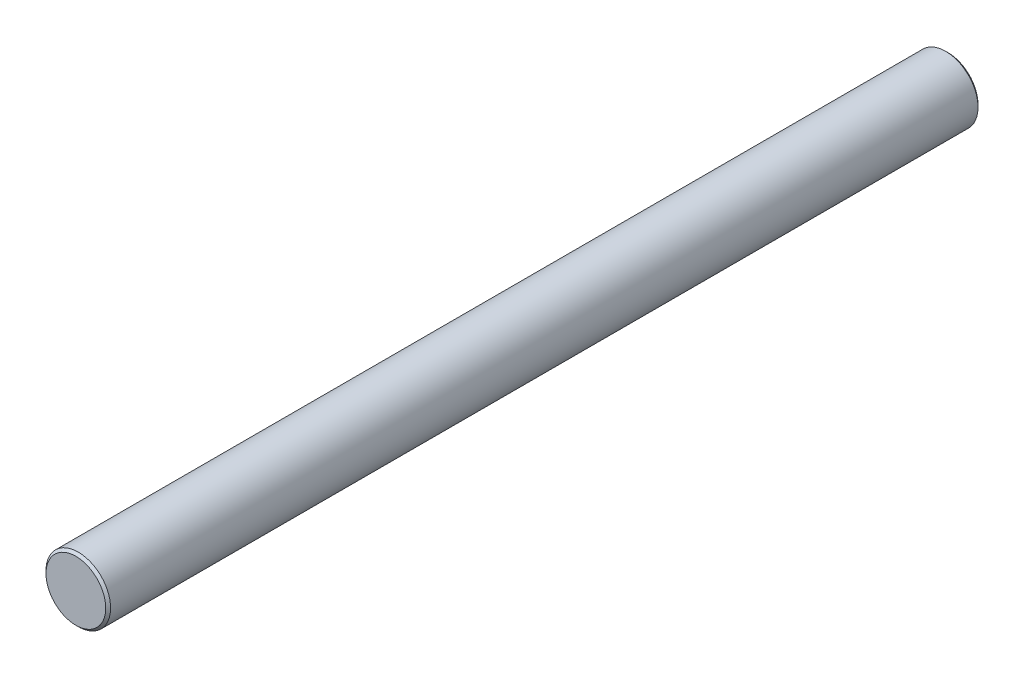
ISO-10303-21;
HEADER;
FILE_DESCRIPTION(('STEP AP214'),'2;1');
FILE_NAME('part.step','',(''),(''),'','','');
FILE_SCHEMA(('AUTOMOTIVE_DESIGN { 1 0 10303 214 1 1 1 1 }'));
ENDSEC;
DATA;
#1=APPLICATION_CONTEXT('core data for automotive mechanical design processes');
#2=APPLICATION_PROTOCOL_DEFINITION('international standard','automotive_design',2000,#1);
#3=PRODUCT_CONTEXT('',#1,'mechanical');
#4=PRODUCT('Part','Part','',(#3));
#5=PRODUCT_RELATED_PRODUCT_CATEGORY('part','',(#4));
#6=PRODUCT_DEFINITION_FORMATION('','',#4);
#7=PRODUCT_DEFINITION_CONTEXT('part definition',#1,'design');
#8=PRODUCT_DEFINITION('design','',#6,#7);
#9=PRODUCT_DEFINITION_SHAPE('','',#8);
#10=(LENGTH_UNIT() NAMED_UNIT(*) SI_UNIT(.MILLI.,.METRE.));
#11=(NAMED_UNIT(*) PLANE_ANGLE_UNIT() SI_UNIT($,.RADIAN.));
#12=(NAMED_UNIT(*) SI_UNIT($,.STERADIAN.) SOLID_ANGLE_UNIT());
#13=UNCERTAINTY_MEASURE_WITH_UNIT(LENGTH_MEASURE(1.E-05),#10,'distance_accuracy_value','');
#14=(GEOMETRIC_REPRESENTATION_CONTEXT(3) GLOBAL_UNCERTAINTY_ASSIGNED_CONTEXT((#13)) GLOBAL_UNIT_ASSIGNED_CONTEXT((#10,
#11,#12)) REPRESENTATION_CONTEXT('',''));
#15=CARTESIAN_POINT('',(0.,0.,0.));
#16=DIRECTION('',(0.,0.,1.));
#17=DIRECTION('',(1.,0.,0.));
#18=AXIS2_PLACEMENT_3D('',#15,#16,#17);
#19=CARTESIAN_POINT('',(0.,9.25,0.));
#20=DIRECTION('',(0.,0.,-1.));
#21=DIRECTION('',(0.,1.,0.));
#22=AXIS2_PLACEMENT_3D('',#19,#20,#21);
#23=PLANE('',#22);
#24=CARTESIAN_POINT('',(0.,0.,0.));
#25=DIRECTION('',(0.,0.,-1.));
#26=DIRECTION('',(0.,1.,0.));
#27=AXIS2_PLACEMENT_3D('',#24,#25,#26);
#28=CIRCLE('',#27,18.5);
#29=CARTESIAN_POINT('',(0.,18.5,0.));
#30=VERTEX_POINT('',#29);
#31=EDGE_CURVE('E9',#30,#30,#28,.T.);
#32=ORIENTED_EDGE('',*,*,#31,.T.);
#33=EDGE_LOOP('',(#32));
#34=FACE_BOUND('',#33,.T.);
#35=CARTESIAN_POINT('',(0.,0.,0.));
#36=DIRECTION('',(0.,0.,1.));
#37=DIRECTION('',(-1.,0.,0.));
#38=AXIS2_PLACEMENT_3D('',#35,#36,#37);
#39=CIRCLE('',#38,6.);
#40=CARTESIAN_POINT('',(-6.,0.,0.));
#41=VERTEX_POINT('',#40);
#42=EDGE_CURVE('E52',#41,#41,#39,.T.);
#43=ORIENTED_EDGE('',*,*,#42,.T.);
#44=EDGE_LOOP('',(#43));
#45=FACE_BOUND('',#44,.T.);
#46=ADVANCED_FACE('F15',(#34,#45),#23,.T.);
#47=CARTESIAN_POINT('',(0.,0.,0.75));
#48=DIRECTION('',(0.,0.,1.));
#49=DIRECTION('',(0.,1.,0.));
#50=AXIS2_PLACEMENT_3D('',#47,#48,#49);
#51=CONICAL_SURFACE('',#50,19.25,0.785398163397448);
#52=CARTESIAN_POINT('',(0.,0.,1.5));
#53=DIRECTION('',(0.,0.,-1.));
#54=DIRECTION('',(0.,1.,0.));
#55=AXIS2_PLACEMENT_3D('',#52,#53,#54);
#56=CIRCLE('',#55,20.);
#57=CARTESIAN_POINT('',(0.,20.,1.5));
#58=VERTEX_POINT('',#57);
#59=EDGE_CURVE('E25',#58,#58,#56,.T.);
#60=ORIENTED_EDGE('',*,*,#59,.T.);
#61=EDGE_LOOP('',(#60));
#62=FACE_BOUND('',#61,.T.);
#63=ORIENTED_EDGE('',*,*,#31,.F.);
#64=EDGE_LOOP('',(#63));
#65=FACE_BOUND('',#64,.T.);
#66=ADVANCED_FACE('F121',(#62,#65),#51,.T.);
#67=CARTESIAN_POINT('',(0.,0.,270.));
#68=DIRECTION('',(0.,0.,1.));
#69=DIRECTION('',(0.,1.,0.));
#70=AXIS2_PLACEMENT_3D('',#67,#68,#69);
#71=CYLINDRICAL_SURFACE('',#70,20.);
#72=CARTESIAN_POINT('',(0.,0.,538.5));
#73=DIRECTION('',(0.,0.,-1.));
#74=DIRECTION('',(0.,1.,0.));
#75=AXIS2_PLACEMENT_3D('',#72,#73,#74);
#76=CIRCLE('',#75,20.);
#77=CARTESIAN_POINT('',(0.,20.,538.5));
#78=VERTEX_POINT('',#77);
#79=EDGE_CURVE('E19',#78,#78,#76,.T.);
#80=ORIENTED_EDGE('',*,*,#79,.T.);
#81=EDGE_LOOP('',(#80));
#82=FACE_BOUND('',#81,.T.);
#83=ORIENTED_EDGE('',*,*,#59,.F.);
#84=EDGE_LOOP('',(#83));
#85=FACE_BOUND('',#84,.T.);
#86=CARTESIAN_POINT('',(0.,0.,6.5));
#87=DIRECTION('',(0.,0.,-1.));
#88=DIRECTION('',(0.,1.,0.));
#89=AXIS2_PLACEMENT_3D('',#86,#87,#88);
#90=CIRCLE('',#89,20.);
#91=CARTESIAN_POINT('',(10.5356537528527,-17.,6.5));
#92=VERTEX_POINT('',#91);
#93=CARTESIAN_POINT('',(-10.5356537528527,-17.,6.5));
#94=VERTEX_POINT('',#93);
#95=EDGE_CURVE('E69',#92,#94,#90,.T.);
#96=ORIENTED_EDGE('',*,*,#95,.T.);
#97=DIRECTION('',(0.,0.,1.));
#98=VECTOR('',#97,1.);
#99=CARTESIAN_POINT('',(-10.5356537528527,-17.,8.25));
#100=LINE('',#99,#98);
#101=CARTESIAN_POINT('',(-10.5356537528527,-17.,10.));
#102=VERTEX_POINT('',#101);
#103=EDGE_CURVE('E62',#94,#102,#100,.T.);
#104=ORIENTED_EDGE('',*,*,#103,.T.);
#105=CARTESIAN_POINT('',(0.,0.,10.));
#106=DIRECTION('',(0.,0.,1.));
#107=DIRECTION('',(0.,1.,0.));
#108=AXIS2_PLACEMENT_3D('',#105,#106,#107);
#109=CIRCLE('',#108,20.);
#110=CARTESIAN_POINT('',(10.5356537528527,-17.,10.));
#111=VERTEX_POINT('',#110);
#112=EDGE_CURVE('E75',#102,#111,#109,.T.);
#113=ORIENTED_EDGE('',*,*,#112,.T.);
#114=DIRECTION('',(0.,0.,-1.));
#115=VECTOR('',#114,1.);
#116=CARTESIAN_POINT('',(10.5356537528527,-17.,8.25));
#117=LINE('',#116,#115);
#118=EDGE_CURVE('E60',#111,#92,#117,.T.);
#119=ORIENTED_EDGE('',*,*,#118,.T.);
#120=EDGE_LOOP('',(#96,#104,#113,#119));
#121=FACE_BOUND('',#120,.T.);
#122=ADVANCED_FACE('F17',(#82,#85,#121),#71,.T.);
#123=CARTESIAN_POINT('',(0.,0.,539.25));
#124=DIRECTION('',(0.,0.,-1.));
#125=DIRECTION('',(0.,1.,0.));
#126=AXIS2_PLACEMENT_3D('',#123,#124,#125);
#127=CONICAL_SURFACE('',#126,19.25,0.785398163397448);
#128=CARTESIAN_POINT('',(0.,0.,540.));
#129=DIRECTION('',(0.,0.,-1.));
#130=DIRECTION('',(0.,1.,0.));
#131=AXIS2_PLACEMENT_3D('',#128,#129,#130);
#132=CIRCLE('',#131,18.5);
#133=CARTESIAN_POINT('',(0.,18.5,540.));
#134=VERTEX_POINT('',#133);
#135=EDGE_CURVE('E44',#134,#134,#132,.T.);
#136=ORIENTED_EDGE('',*,*,#135,.T.);
#137=EDGE_LOOP('',(#136));
#138=FACE_BOUND('',#137,.T.);
#139=ORIENTED_EDGE('',*,*,#79,.F.);
#140=EDGE_LOOP('',(#139));
#141=FACE_BOUND('',#140,.T.);
#142=ADVANCED_FACE('F116',(#138,#141),#127,.T.);
#143=CARTESIAN_POINT('',(0.,9.25,540.));
#144=DIRECTION('',(0.,0.,1.));
#145=DIRECTION('',(0.,-1.,0.));
#146=AXIS2_PLACEMENT_3D('',#143,#144,#145);
#147=PLANE('',#146);
#148=ORIENTED_EDGE('',*,*,#135,.F.);
#149=EDGE_LOOP('',(#148));
#150=FACE_BOUND('',#149,.T.);
#151=ADVANCED_FACE('F110',(#150),#147,.T.);
#152=CARTESIAN_POINT('',(0.,0.,26.4586213285198));
#153=DIRECTION('',(0.,0.,-1.));
#154=DIRECTION('',(-1.,0.,0.));
#155=AXIS2_PLACEMENT_3D('',#152,#153,#154);
#156=CONICAL_SURFACE('',#155,2.52640625,1.0471975511966);
#157=CARTESIAN_POINT('',(0.,0.,25.));
#158=DIRECTION('',(0.,0.,1.));
#159=DIRECTION('',(-1.,0.,0.));
#160=AXIS2_PLACEMENT_3D('',#157,#158,#159);
#161=CIRCLE('',#160,5.0528125);
#162=CARTESIAN_POINT('',(-5.0528125,0.,25.));
#163=VERTEX_POINT('',#162);
#164=EDGE_CURVE('E51',#163,#163,#161,.T.);
#165=ORIENTED_EDGE('',*,*,#164,.F.);
#166=EDGE_LOOP('',(#165));
#167=FACE_BOUND('',#166,.T.);
#168=CARTESIAN_POINT('',(0.,0.,27.9172426570397));
#169=VERTEX_POINT('',#168);
#170=VERTEX_LOOP('',#169);
#171=FACE_BOUND('',#170,.T.);
#172=ADVANCED_FACE('F104',(#167,#171),#156,.F.);
#173=CARTESIAN_POINT('',(0.,0.,12.97359375));
#174=DIRECTION('',(0.,0.,-1.));
#175=DIRECTION('',(-1.,0.,0.));
#176=AXIS2_PLACEMENT_3D('',#173,#174,#175);
#177=CYLINDRICAL_SURFACE('',#176,5.0528125);
#178=CARTESIAN_POINT('',(0.,0.,0.9471875));
#179=DIRECTION('',(0.,0.,1.));
#180=DIRECTION('',(-1.,0.,0.));
#181=AXIS2_PLACEMENT_3D('',#178,#179,#180);
#182=CIRCLE('',#181,5.0528125);
#183=CARTESIAN_POINT('',(-5.0528125,0.,0.9471875));
#184=VERTEX_POINT('',#183);
#185=EDGE_CURVE('E57',#184,#184,#182,.T.);
#186=ORIENTED_EDGE('',*,*,#185,.F.);
#187=EDGE_LOOP('',(#186));
#188=FACE_BOUND('',#187,.T.);
#189=ORIENTED_EDGE('',*,*,#164,.T.);
#190=EDGE_LOOP('',(#189));
#191=FACE_BOUND('',#190,.T.);
#192=ADVANCED_FACE('F101',(#188,#191),#177,.F.);
#193=CARTESIAN_POINT('',(0.,0.,0.47359375));
#194=DIRECTION('',(0.,0.,-1.));
#195=DIRECTION('',(-1.,0.,0.));
#196=AXIS2_PLACEMENT_3D('',#193,#194,#195);
#197=CONICAL_SURFACE('',#196,5.52640625,0.785398163397448);
#198=ORIENTED_EDGE('',*,*,#42,.F.);
#199=EDGE_LOOP('',(#198));
#200=FACE_BOUND('',#199,.T.);
#201=ORIENTED_EDGE('',*,*,#185,.T.);
#202=EDGE_LOOP('',(#201));
#203=FACE_BOUND('',#202,.T.);
#204=ADVANCED_FACE('F99',(#200,#203),#197,.F.);
#205=CARTESIAN_POINT('',(0.,-17.,8.25));
#206=DIRECTION('',(0.,-1.,0.));
#207=DIRECTION('',(0.,0.,-1.));
#208=AXIS2_PLACEMENT_3D('',#205,#206,#207);
#209=PLANE('',#208);
#210=ORIENTED_EDGE('',*,*,#103,.F.);
#211=DIRECTION('',(1.,0.,0.));
#212=VECTOR('',#211,1.);
#213=CARTESIAN_POINT('',(0.,-17.,6.5));
#214=LINE('',#213,#212);
#215=EDGE_CURVE('E66',#94,#92,#214,.T.);
#216=ORIENTED_EDGE('',*,*,#215,.T.);
#217=ORIENTED_EDGE('',*,*,#118,.F.);
#218=DIRECTION('',(-1.,0.,0.));
#219=VECTOR('',#218,1.);
#220=CARTESIAN_POINT('',(0.,-17.,10.));
#221=LINE('',#220,#219);
#222=EDGE_CURVE('E72',#111,#102,#221,.T.);
#223=ORIENTED_EDGE('',*,*,#222,.T.);
#224=EDGE_LOOP('',(#210,#216,#217,#223));
#225=FACE_BOUND('',#224,.T.);
#226=ADVANCED_FACE('F131',(#225),#209,.T.);
#227=CARTESIAN_POINT('',(0.,-19.5,6.5));
#228=DIRECTION('',(0.,0.,1.));
#229=DIRECTION('',(1.,0.,0.));
#230=AXIS2_PLACEMENT_3D('',#227,#228,#229);
#231=PLANE('',#230);
#232=ORIENTED_EDGE('',*,*,#95,.F.);
#233=ORIENTED_EDGE('',*,*,#215,.F.);
#234=EDGE_LOOP('',(#232,#233));
#235=FACE_BOUND('',#234,.T.);
#236=ADVANCED_FACE('F135',(#235),#231,.T.);
#237=CARTESIAN_POINT('',(0.,-19.5,10.));
#238=DIRECTION('',(0.,0.,1.));
#239=DIRECTION('',(1.,0.,0.));
#240=AXIS2_PLACEMENT_3D('',#237,#238,#239);
#241=PLANE('',#240);
#242=ORIENTED_EDGE('',*,*,#112,.F.);
#243=ORIENTED_EDGE('',*,*,#222,.F.);
#244=EDGE_LOOP('',(#242,#243));
#245=FACE_BOUND('',#244,.T.);
#246=ADVANCED_FACE('F87',(#245),#241,.F.);
#247=CLOSED_SHELL('',(#46,#66,#122,#142,#151,#172,#192,#204,#226,#236,#246));
#248=MANIFOLD_SOLID_BREP('B1',#247);
#249=ADVANCED_BREP_SHAPE_REPRESENTATION('',(#18,#248),#14);
#250=SHAPE_DEFINITION_REPRESENTATION(#9,#249);
ENDSEC;
END-ISO-10303-21;
